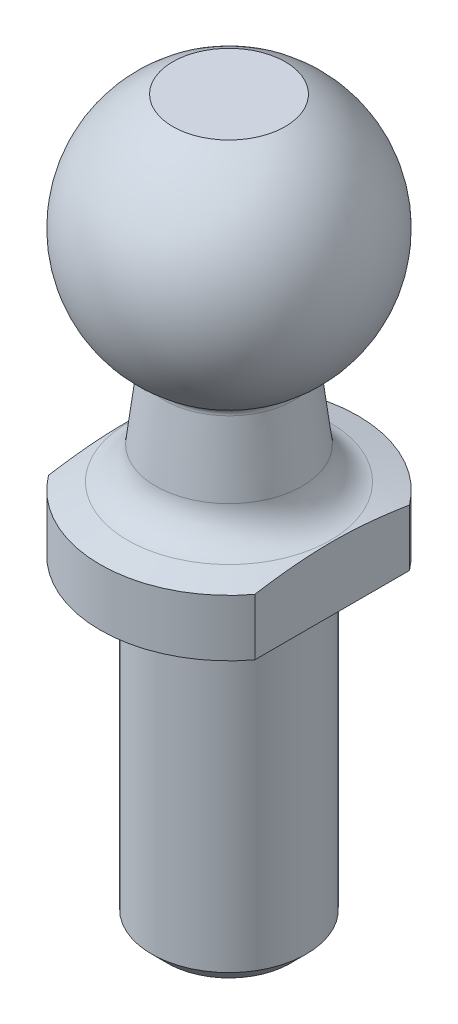
ISO-10303-21;
HEADER;
FILE_DESCRIPTION(('STEP AP214'),'2;1');
FILE_NAME('part.step','',(''),(''),'','','');
FILE_SCHEMA(('AUTOMOTIVE_DESIGN { 1 0 10303 214 1 1 1 1 }'));
ENDSEC;
DATA;
#1=APPLICATION_CONTEXT('core data for automotive mechanical design processes');
#2=APPLICATION_PROTOCOL_DEFINITION('international standard','automotive_design',2000,#1);
#3=PRODUCT_CONTEXT('',#1,'mechanical');
#4=PRODUCT('Part','Part','',(#3));
#5=PRODUCT_RELATED_PRODUCT_CATEGORY('part','',(#4));
#6=PRODUCT_DEFINITION_FORMATION('','',#4);
#7=PRODUCT_DEFINITION_CONTEXT('part definition',#1,'design');
#8=PRODUCT_DEFINITION('design','',#6,#7);
#9=PRODUCT_DEFINITION_SHAPE('','',#8);
#10=(LENGTH_UNIT() NAMED_UNIT(*) SI_UNIT(.MILLI.,.METRE.));
#11=(NAMED_UNIT(*) PLANE_ANGLE_UNIT() SI_UNIT($,.RADIAN.));
#12=(NAMED_UNIT(*) SI_UNIT($,.STERADIAN.) SOLID_ANGLE_UNIT());
#13=UNCERTAINTY_MEASURE_WITH_UNIT(LENGTH_MEASURE(1.E-05),#10,'distance_accuracy_value','');
#14=(GEOMETRIC_REPRESENTATION_CONTEXT(3) GLOBAL_UNCERTAINTY_ASSIGNED_CONTEXT((#13)) GLOBAL_UNIT_ASSIGNED_CONTEXT((#10,
#11,#12)) REPRESENTATION_CONTEXT('',''));
#15=CARTESIAN_POINT('',(0.,0.,0.));
#16=DIRECTION('',(0.,0.,1.));
#17=DIRECTION('',(1.,0.,0.));
#18=AXIS2_PLACEMENT_3D('',#15,#16,#17);
#19=CARTESIAN_POINT('',(0.,-23.5,0.));
#20=DIRECTION('',(0.,-1.,0.));
#21=DIRECTION('',(0.,0.,-1.));
#22=AXIS2_PLACEMENT_3D('',#19,#20,#21);
#23=PLANE('',#22);
#24=CARTESIAN_POINT('',(0.,-23.5,0.));
#25=DIRECTION('',(0.,-1.,0.));
#26=DIRECTION('',(1.,0.,0.));
#27=AXIS2_PLACEMENT_3D('',#24,#25,#26);
#28=CIRCLE('',#27,2.3865);
#29=CARTESIAN_POINT('',(0.,-23.5,-2.3865));
#30=VERTEX_POINT('',#29);
#31=EDGE_CURVE('E11',#30,#30,#28,.T.);
#32=ORIENTED_EDGE('',*,*,#31,.T.);
#33=EDGE_LOOP('',(#32));
#34=FACE_BOUND('',#33,.T.);
#35=ADVANCED_FACE('F16',(#34),#23,.T.);
#36=CARTESIAN_POINT('',(0.,-23.19325,0.));
#37=DIRECTION('',(0.,1.,0.));
#38=DIRECTION('',(0.,0.,-1.));
#39=AXIS2_PLACEMENT_3D('',#36,#37,#38);
#40=CONICAL_SURFACE('',#39,2.69325,0.785398163397449);
#41=CARTESIAN_POINT('',(0.,-22.8865,0.));
#42=DIRECTION('',(0.,-1.,0.));
#43=DIRECTION('',(1.,0.,0.));
#44=AXIS2_PLACEMENT_3D('',#41,#42,#43);
#45=CIRCLE('',#44,3.);
#46=CARTESIAN_POINT('',(0.,-22.8865,-3.));
#47=VERTEX_POINT('',#46);
#48=EDGE_CURVE('E25',#47,#47,#45,.T.);
#49=ORIENTED_EDGE('',*,*,#48,.T.);
#50=EDGE_LOOP('',(#49));
#51=FACE_BOUND('',#50,.T.);
#52=ORIENTED_EDGE('',*,*,#31,.F.);
#53=EDGE_LOOP('',(#52));
#54=FACE_BOUND('',#53,.T.);
#55=ADVANCED_FACE('F222',(#51,#54),#40,.T.);
#56=CARTESIAN_POINT('',(0.,-17.54325,0.));
#57=DIRECTION('',(0.,1.,0.));
#58=DIRECTION('',(0.,0.,-1.));
#59=AXIS2_PLACEMENT_3D('',#56,#57,#58);
#60=CYLINDRICAL_SURFACE('',#59,3.);
#61=ORIENTED_EDGE('',*,*,#48,.F.);
#62=EDGE_LOOP('',(#61));
#63=FACE_BOUND('',#62,.T.);
#64=CARTESIAN_POINT('',(0.,-11.3,0.));
#65=DIRECTION('',(0.,-1.,0.));
#66=DIRECTION('',(1.,0.,0.));
#67=AXIS2_PLACEMENT_3D('',#64,#65,#66);
#68=CIRCLE('',#67,3.);
#69=CARTESIAN_POINT('',(0.,-11.3,-3.));
#70=VERTEX_POINT('',#69);
#71=EDGE_CURVE('E145',#70,#70,#68,.T.);
#72=ORIENTED_EDGE('',*,*,#71,.T.);
#73=EDGE_LOOP('',(#72));
#74=FACE_BOUND('',#73,.T.);
#75=ADVANCED_FACE('F226',(#63,#74),#60,.T.);
#76=CARTESIAN_POINT('',(0.,-11.2999999999999,0.));
#77=DIRECTION('',(0.,-1.,0.));
#78=DIRECTION('',(0.,0.,-1.));
#79=AXIS2_PLACEMENT_3D('',#76,#77,#78);
#80=TOROIDAL_SURFACE('',#79,3.29999999999988,0.299999999999878);
#81=CARTESIAN_POINT('',(0.,-11.,0.));
#82=DIRECTION('',(0.,-1.,0.));
#83=DIRECTION('',(1.,0.,0.));
#84=AXIS2_PLACEMENT_3D('',#81,#82,#83);
#85=CIRCLE('',#84,3.3);
#86=CARTESIAN_POINT('',(0.,-11.,-3.3));
#87=VERTEX_POINT('',#86);
#88=EDGE_CURVE('E107',#87,#87,#85,.T.);
#89=ORIENTED_EDGE('',*,*,#88,.T.);
#90=EDGE_LOOP('',(#89));
#91=FACE_BOUND('',#90,.T.);
#92=ORIENTED_EDGE('',*,*,#71,.F.);
#93=EDGE_LOOP('',(#92));
#94=FACE_BOUND('',#93,.T.);
#95=ADVANCED_FACE('F229',(#91,#94),#80,.F.);
#96=CARTESIAN_POINT('',(0.,-11.,-3.3));
#97=DIRECTION('',(0.,-1.,0.));
#98=DIRECTION('',(0.,0.,-1.));
#99=AXIS2_PLACEMENT_3D('',#96,#97,#98);
#100=PLANE('',#99);
#101=ORIENTED_EDGE('',*,*,#88,.F.);
#102=EDGE_LOOP('',(#101));
#103=FACE_BOUND('',#102,.T.);
#104=DIRECTION('',(0.,0.,1.));
#105=VECTOR('',#104,1.);
#106=CARTESIAN_POINT('',(4.,-11.,-0.15));
#107=LINE('',#106,#105);
#108=CARTESIAN_POINT('',(4.,-11.,-3.));
#109=VERTEX_POINT('',#108);
#110=CARTESIAN_POINT('',(4.,-11.,3.));
#111=VERTEX_POINT('',#110);
#112=EDGE_CURVE('E102',#109,#111,#107,.T.);
#113=ORIENTED_EDGE('',*,*,#112,.T.);
#114=CARTESIAN_POINT('',(0.,-11.,0.));
#115=DIRECTION('',(0.,-1.,0.));
#116=DIRECTION('',(1.,0.,0.));
#117=AXIS2_PLACEMENT_3D('',#114,#115,#116);
#118=CIRCLE('',#117,5.);
#119=CARTESIAN_POINT('',(-4.,-11.,3.));
#120=VERTEX_POINT('',#119);
#121=EDGE_CURVE('E95',#111,#120,#118,.T.);
#122=ORIENTED_EDGE('',*,*,#121,.T.);
#123=DIRECTION('',(0.,0.,-1.));
#124=VECTOR('',#123,1.);
#125=CARTESIAN_POINT('',(-4.,-11.,-3.15));
#126=LINE('',#125,#124);
#127=CARTESIAN_POINT('',(-4.,-11.,-3.));
#128=VERTEX_POINT('',#127);
#129=EDGE_CURVE('E99',#120,#128,#126,.T.);
#130=ORIENTED_EDGE('',*,*,#129,.T.);
#131=CARTESIAN_POINT('',(0.,-11.,0.));
#132=DIRECTION('',(0.,-1.,0.));
#133=DIRECTION('',(1.,0.,0.));
#134=AXIS2_PLACEMENT_3D('',#131,#132,#133);
#135=CIRCLE('',#134,5.);
#136=EDGE_CURVE('E137',#128,#109,#135,.T.);
#137=ORIENTED_EDGE('',*,*,#136,.T.);
#138=EDGE_LOOP('',(#113,#122,#130,#137));
#139=FACE_BOUND('',#138,.T.);
#140=ADVANCED_FACE('F97',(#103,#139),#100,.T.);
#141=CARTESIAN_POINT('',(0.,-9.9,0.));
#142=DIRECTION('',(0.,1.,0.));
#143=DIRECTION('',(0.,0.,-1.));
#144=AXIS2_PLACEMENT_3D('',#141,#142,#143);
#145=CYLINDRICAL_SURFACE('',#144,5.);
#146=DIRECTION('',(0.,1.,0.));
#147=VECTOR('',#146,1.);
#148=CARTESIAN_POINT('',(4.,-9.9,3.));
#149=LINE('',#148,#147);
#150=CARTESIAN_POINT('',(4.,-8.8,3.));
#151=VERTEX_POINT('',#150);
#152=EDGE_CURVE('E133',#111,#151,#149,.T.);
#153=ORIENTED_EDGE('',*,*,#152,.T.);
#154=CARTESIAN_POINT('',(0.,-8.8,0.));
#155=DIRECTION('',(0.,-1.,0.));
#156=DIRECTION('',(1.,0.,0.));
#157=AXIS2_PLACEMENT_3D('',#154,#155,#156);
#158=CIRCLE('',#157,5.);
#159=CARTESIAN_POINT('',(-4.,-8.8,3.));
#160=VERTEX_POINT('',#159);
#161=EDGE_CURVE('E113',#151,#160,#158,.T.);
#162=ORIENTED_EDGE('',*,*,#161,.T.);
#163=DIRECTION('',(0.,-1.,0.));
#164=VECTOR('',#163,1.);
#165=CARTESIAN_POINT('',(-4.,-9.9,3.));
#166=LINE('',#165,#164);
#167=EDGE_CURVE('E111',#160,#120,#166,.T.);
#168=ORIENTED_EDGE('',*,*,#167,.T.);
#169=ORIENTED_EDGE('',*,*,#121,.F.);
#170=EDGE_LOOP('',(#153,#162,#168,#169));
#171=FACE_BOUND('',#170,.T.);
#172=ADVANCED_FACE('F112',(#171),#145,.T.);
#173=CARTESIAN_POINT('',(0.,4.4999999999999,-2.1794494717704));
#174=DIRECTION('',(0.,1.,0.));
#175=DIRECTION('',(0.,0.,1.));
#176=AXIS2_PLACEMENT_3D('',#173,#174,#175);
#177=PLANE('',#176);
#178=CARTESIAN_POINT('',(0.,4.4999999999999,0.));
#179=DIRECTION('',(0.,-1.,0.));
#180=DIRECTION('',(1.,0.,0.));
#181=AXIS2_PLACEMENT_3D('',#178,#179,#180);
#182=CIRCLE('',#181,2.1794494717704);
#183=CARTESIAN_POINT('',(0.,4.4999999999999,-2.1794494717704));
#184=VERTEX_POINT('',#183);
#185=EDGE_CURVE('E165',#184,#184,#182,.T.);
#186=ORIENTED_EDGE('',*,*,#185,.F.);
#187=EDGE_LOOP('',(#186));
#188=FACE_BOUND('',#187,.T.);
#189=ADVANCED_FACE('F208',(#188),#177,.T.);
#190=CARTESIAN_POINT('',(0.,-7.06659598375648,0.));
#191=DIRECTION('',(0.,-1.,0.));
#192=DIRECTION('',(0.,0.,-1.));
#193=AXIS2_PLACEMENT_3D('',#190,#191,#192);
#194=TOROIDAL_SURFACE('',#193,4.32640309906878,1.49999999999977);
#195=CARTESIAN_POINT('',(0.,-7.249399998864,0.));
#196=DIRECTION('',(0.,-1.,0.));
#197=DIRECTION('',(1.,0.,0.));
#198=AXIS2_PLACEMENT_3D('',#195,#196,#197);
#199=CIRCLE('',#198,2.837583871607);
#200=CARTESIAN_POINT('',(0.,-7.249399998864,-2.837583871607));
#201=VERTEX_POINT('',#200);
#202=EDGE_CURVE('E108',#201,#201,#199,.T.);
#203=ORIENTED_EDGE('',*,*,#202,.T.);
#204=EDGE_LOOP('',(#203));
#205=FACE_BOUND('',#204,.T.);
#206=CARTESIAN_POINT('',(0.,-8.5154847231899,0.));
#207=DIRECTION('',(0.,-1.,0.));
#208=DIRECTION('',(1.,0.,0.));
#209=AXIS2_PLACEMENT_3D('',#206,#207,#208);
#210=CIRCLE('',#209,3.9381745314152);
#211=CARTESIAN_POINT('',(0.,-8.5154847231899,-3.9381745314152));
#212=VERTEX_POINT('',#211);
#213=EDGE_CURVE('E118',#212,#212,#210,.T.);
#214=ORIENTED_EDGE('',*,*,#213,.F.);
#215=EDGE_LOOP('',(#214));
#216=FACE_BOUND('',#215,.T.);
#217=ADVANCED_FACE('F210',(#205,#216),#194,.F.);
#218=CARTESIAN_POINT('',(0.,-5.8923289189762,0.));
#219=DIRECTION('',(0.,-1.,0.));
#220=DIRECTION('',(0.,0.,-1.));
#221=AXIS2_PLACEMENT_3D('',#218,#219,#220);
#222=CONICAL_SURFACE('',#221,2.67095649494895,0.122173047639601);
#223=CARTESIAN_POINT('',(0.,-4.5352578390884,0.));
#224=DIRECTION('',(0.,-1.,0.));
#225=DIRECTION('',(1.,0.,0.));
#226=AXIS2_PLACEMENT_3D('',#223,#224,#225);
#227=CIRCLE('',#226,2.5043291182909);
#228=CARTESIAN_POINT('',(0.,-4.5352578390884,-2.5043291182909));
#229=VERTEX_POINT('',#228);
#230=EDGE_CURVE('E155',#229,#229,#227,.T.);
#231=ORIENTED_EDGE('',*,*,#230,.T.);
#232=EDGE_LOOP('',(#231));
#233=FACE_BOUND('',#232,.T.);
#234=ORIENTED_EDGE('',*,*,#202,.F.);
#235=EDGE_LOOP('',(#234));
#236=FACE_BOUND('',#235,.T.);
#237=ADVANCED_FACE('F216',(#233,#236),#222,.T.);
#238=CARTESIAN_POINT('',(0.,-4.49869703606676,0.));
#239=DIRECTION('',(0.,-1.,0.));
#240=DIRECTION('',(0.,0.,-1.));
#241=AXIS2_PLACEMENT_3D('',#238,#239,#240);
#242=TOROIDAL_SURFACE('',#241,2.80209296378324,0.299999999999951);
#243=CARTESIAN_POINT('',(0.,-4.2440538076102,0.));
#244=DIRECTION('',(0.,-1.,0.));
#245=DIRECTION('',(1.,0.,0.));
#246=AXIS2_PLACEMENT_3D('',#243,#244,#245);
#247=CIRCLE('',#246,2.6434839280974);
#248=CARTESIAN_POINT('',(0.,-4.2440538076102,-2.6434839280974));
#249=VERTEX_POINT('',#248);
#250=EDGE_CURVE('E139',#249,#249,#247,.T.);
#251=ORIENTED_EDGE('',*,*,#250,.T.);
#252=EDGE_LOOP('',(#251));
#253=FACE_BOUND('',#252,.T.);
#254=ORIENTED_EDGE('',*,*,#230,.F.);
#255=EDGE_LOOP('',(#254));
#256=FACE_BOUND('',#255,.T.);
#257=ADVANCED_FACE('F236',(#253,#256),#242,.F.);
#258=CARTESIAN_POINT('',(0.,0.,0.));
#259=DIRECTION('',(1.,0.,0.));
#260=DIRECTION('',(0.,-1.,0.));
#261=AXIS2_PLACEMENT_3D('',#258,#259,#260);
#262=SPHERICAL_SURFACE('',#261,5.);
#263=CARTESIAN_POINT('',(0.,0.,0.));
#264=DIRECTION('',(0.,-1.,0.));
#265=DIRECTION('',(1.,0.,0.));
#266=AXIS2_PLACEMENT_3D('',#263,#264,#265);
#267=SPHERICAL_SURFACE('',#266,5.);
#268=ORIENTED_EDGE('',*,*,#185,.T.);
#269=EDGE_LOOP('',(#268));
#270=FACE_BOUND('',#269,.T.);
#271=ORIENTED_EDGE('',*,*,#250,.F.);
#272=EDGE_LOOP('',(#271));
#273=FACE_BOUND('',#272,.T.);
#274=ADVANCED_FACE('F205',(#270,#273),#267,.T.);
#275=CARTESIAN_POINT('',(0.,-9.9,0.));
#276=DIRECTION('',(0.,1.,0.));
#277=DIRECTION('',(0.,0.,-1.));
#278=AXIS2_PLACEMENT_3D('',#275,#276,#277);
#279=CYLINDRICAL_SURFACE('',#278,5.);
#280=DIRECTION('',(0.,-1.,0.));
#281=VECTOR('',#280,1.);
#282=CARTESIAN_POINT('',(4.,-9.9,-3.));
#283=LINE('',#282,#281);
#284=CARTESIAN_POINT('',(4.,-8.8,-3.));
#285=VERTEX_POINT('',#284);
#286=EDGE_CURVE('E141',#285,#109,#283,.T.);
#287=ORIENTED_EDGE('',*,*,#286,.T.);
#288=ORIENTED_EDGE('',*,*,#136,.F.);
#289=DIRECTION('',(0.,1.,0.));
#290=VECTOR('',#289,1.);
#291=CARTESIAN_POINT('',(-4.,-9.9,-3.));
#292=LINE('',#291,#290);
#293=CARTESIAN_POINT('',(-4.,-8.8,-3.));
#294=VERTEX_POINT('',#293);
#295=EDGE_CURVE('E122',#128,#294,#292,.T.);
#296=ORIENTED_EDGE('',*,*,#295,.T.);
#297=CARTESIAN_POINT('',(0.,-8.8,0.));
#298=DIRECTION('',(0.,-1.,0.));
#299=DIRECTION('',(1.,0.,0.));
#300=AXIS2_PLACEMENT_3D('',#297,#298,#299);
#301=CIRCLE('',#300,5.);
#302=EDGE_CURVE('E159',#294,#285,#301,.T.);
#303=ORIENTED_EDGE('',*,*,#302,.T.);
#304=EDGE_LOOP('',(#287,#288,#296,#303));
#305=FACE_BOUND('',#304,.T.);
#306=ADVANCED_FACE('F235',(#305),#279,.T.);
#307=CARTESIAN_POINT('',(0.,-8.65774236159495,0.));
#308=DIRECTION('',(0.,-1.,0.));
#309=DIRECTION('',(0.,0.,-1.));
#310=AXIS2_PLACEMENT_3D('',#307,#308,#309);
#311=CONICAL_SURFACE('',#310,4.4690872657076,1.30899693899574);
#312=CARTESIAN_POINT('',(4.,-8.8,3.));
#313=CARTESIAN_POINT('',(4.,-8.31769145362397,0.));
#314=CARTESIAN_POINT('',(4.,-8.8,-3.));
#315=(BOUNDED_CURVE() B_SPLINE_CURVE(2,(#312,#313,#314),.UNSPECIFIED.,.F.,
.F.) B_SPLINE_CURVE_WITH_KNOTS((3,3),(0.,0.60238847166009),
.UNSPECIFIED.) CURVE() GEOMETRIC_REPRESENTATION_ITEM() RATIONAL_B_SPLINE_CURVE((1.,1.25,1.)) REPRESENTATION_ITEM(''));
#316=EDGE_CURVE('E136',#151,#285,#315,.T.);
#317=ORIENTED_EDGE('',*,*,#316,.T.);
#318=ORIENTED_EDGE('',*,*,#302,.F.);
#319=CARTESIAN_POINT('',(-4.,-8.8,-3.));
#320=CARTESIAN_POINT('',(-4.,-8.31769145362397,0.));
#321=CARTESIAN_POINT('',(-4.,-8.8,3.));
#322=(BOUNDED_CURVE() B_SPLINE_CURVE(2,(#319,#320,#321),.UNSPECIFIED.,.F.,
.F.) B_SPLINE_CURVE_WITH_KNOTS((3,3),(0.,0.60238847166009),
.UNSPECIFIED.) CURVE() GEOMETRIC_REPRESENTATION_ITEM() RATIONAL_B_SPLINE_CURVE((1.,1.25,1.)) REPRESENTATION_ITEM(''));
#323=EDGE_CURVE('E128',#294,#160,#322,.T.);
#324=ORIENTED_EDGE('',*,*,#323,.T.);
#325=ORIENTED_EDGE('',*,*,#161,.F.);
#326=EDGE_LOOP('',(#317,#318,#324,#325));
#327=FACE_BOUND('',#326,.T.);
#328=ORIENTED_EDGE('',*,*,#213,.T.);
#329=EDGE_LOOP('',(#328));
#330=FACE_BOUND('',#329,.T.);
#331=ADVANCED_FACE('F18',(#327,#330),#311,.T.);
#332=CARTESIAN_POINT('',(-4.,-11.,-3.));
#333=DIRECTION('',(-1.,0.,0.));
#334=DIRECTION('',(0.,0.,1.));
#335=AXIS2_PLACEMENT_3D('',#332,#333,#334);
#336=PLANE('',#335);
#337=ORIENTED_EDGE('',*,*,#323,.F.);
#338=ORIENTED_EDGE('',*,*,#295,.F.);
#339=ORIENTED_EDGE('',*,*,#129,.F.);
#340=ORIENTED_EDGE('',*,*,#167,.F.);
#341=EDGE_LOOP('',(#337,#338,#339,#340));
#342=FACE_BOUND('',#341,.T.);
#343=ADVANCED_FACE('F120',(#342),#336,.T.);
#344=CARTESIAN_POINT('',(4.,-11.,3.));
#345=DIRECTION('',(1.,0.,0.));
#346=DIRECTION('',(0.,0.,-1.));
#347=AXIS2_PLACEMENT_3D('',#344,#345,#346);
#348=PLANE('',#347);
#349=ORIENTED_EDGE('',*,*,#316,.F.);
#350=ORIENTED_EDGE('',*,*,#152,.F.);
#351=ORIENTED_EDGE('',*,*,#112,.F.);
#352=ORIENTED_EDGE('',*,*,#286,.F.);
#353=EDGE_LOOP('',(#349,#350,#351,#352));
#354=FACE_BOUND('',#353,.T.);
#355=ADVANCED_FACE('F240',(#354),#348,.T.);
#356=CLOSED_SHELL('',(#35,#55,#75,#95,#140,#172,#189,#217,#237,#257,#274,#306,#331,#343,#355));
#357=MANIFOLD_SOLID_BREP('B1',#356);
#358=ADVANCED_BREP_SHAPE_REPRESENTATION('',(#18,#357),#14);
#359=SHAPE_DEFINITION_REPRESENTATION(#9,#358);
ENDSEC;
END-ISO-10303-21;
